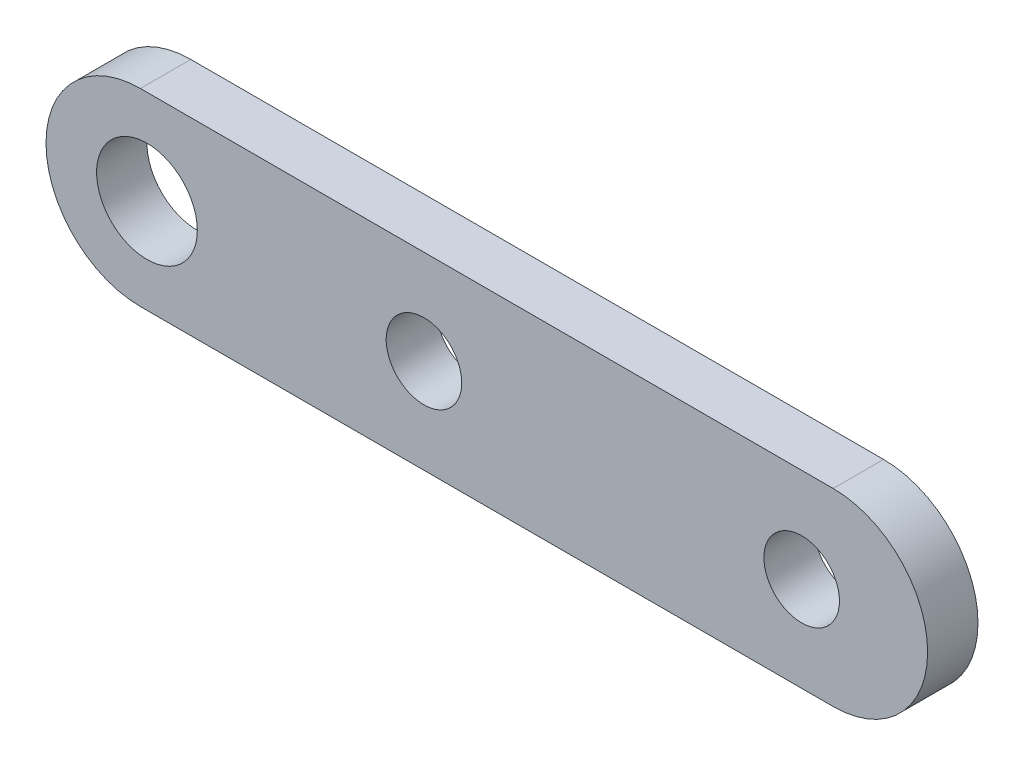
ISO-10303-21;
HEADER;
FILE_DESCRIPTION(('STEP AP214'),'2;1');
FILE_NAME('part.step','',(''),(''),'','','');
FILE_SCHEMA(('AUTOMOTIVE_DESIGN { 1 0 10303 214 1 1 1 1 }'));
ENDSEC;
DATA;
#1=APPLICATION_CONTEXT('core data for automotive mechanical design processes');
#2=APPLICATION_PROTOCOL_DEFINITION('international standard','automotive_design',2000,#1);
#3=PRODUCT_CONTEXT('',#1,'mechanical');
#4=PRODUCT('Part','Part','',(#3));
#5=PRODUCT_RELATED_PRODUCT_CATEGORY('part','',(#4));
#6=PRODUCT_DEFINITION_FORMATION('','',#4);
#7=PRODUCT_DEFINITION_CONTEXT('part definition',#1,'design');
#8=PRODUCT_DEFINITION('design','',#6,#7);
#9=PRODUCT_DEFINITION_SHAPE('','',#8);
#10=(LENGTH_UNIT() NAMED_UNIT(*) SI_UNIT(.MILLI.,.METRE.));
#11=(NAMED_UNIT(*) PLANE_ANGLE_UNIT() SI_UNIT($,.RADIAN.));
#12=(NAMED_UNIT(*) SI_UNIT($,.STERADIAN.) SOLID_ANGLE_UNIT());
#13=UNCERTAINTY_MEASURE_WITH_UNIT(LENGTH_MEASURE(1.E-05),#10,'distance_accuracy_value','');
#14=(GEOMETRIC_REPRESENTATION_CONTEXT(3) GLOBAL_UNCERTAINTY_ASSIGNED_CONTEXT((#13)) GLOBAL_UNIT_ASSIGNED_CONTEXT((#10,
#11,#12)) REPRESENTATION_CONTEXT('',''));
#15=CARTESIAN_POINT('',(0.,0.,0.));
#16=DIRECTION('',(0.,0.,1.));
#17=DIRECTION('',(1.,0.,0.));
#18=AXIS2_PLACEMENT_3D('',#15,#16,#17);
#19=CARTESIAN_POINT('',(62.5026875852541,7.5,4.));
#20=DIRECTION('',(0.,0.,-1.));
#21=DIRECTION('',(-1.,0.,0.));
#22=AXIS2_PLACEMENT_3D('',#19,#20,#21);
#23=CYLINDRICAL_SURFACE('',#22,7.5);
#24=CARTESIAN_POINT('',(62.5026875852541,7.5,0.));
#25=DIRECTION('',(0.,0.,1.));
#26=DIRECTION('',(1.,0.,0.));
#27=AXIS2_PLACEMENT_3D('',#24,#25,#26);
#28=CIRCLE('',#27,7.5);
#29=CARTESIAN_POINT('',(62.5026875852541,0.,0.));
#30=VERTEX_POINT('',#29);
#31=CARTESIAN_POINT('',(62.5026875852541,15.,0.));
#32=VERTEX_POINT('',#31);
#33=EDGE_CURVE('E98',#30,#32,#28,.T.);
#34=ORIENTED_EDGE('',*,*,#33,.T.);
#35=DIRECTION('',(0.,0.,-1.));
#36=VECTOR('',#35,1.);
#37=CARTESIAN_POINT('',(62.5026875852541,15.,4.));
#38=LINE('',#37,#36);
#39=CARTESIAN_POINT('',(62.5026875852541,15.,4.));
#40=VERTEX_POINT('',#39);
#41=EDGE_CURVE('E11',#40,#32,#38,.T.);
#42=ORIENTED_EDGE('',*,*,#41,.F.);
#43=CARTESIAN_POINT('',(62.5026875852541,7.5,4.));
#44=DIRECTION('',(0.,0.,1.));
#45=DIRECTION('',(1.,0.,0.));
#46=AXIS2_PLACEMENT_3D('',#43,#44,#45);
#47=CIRCLE('',#46,7.5);
#48=CARTESIAN_POINT('',(62.5026875852541,0.,4.));
#49=VERTEX_POINT('',#48);
#50=EDGE_CURVE('E86',#49,#40,#47,.T.);
#51=ORIENTED_EDGE('',*,*,#50,.F.);
#52=DIRECTION('',(0.,0.,-1.));
#53=VECTOR('',#52,1.);
#54=CARTESIAN_POINT('',(62.5026875852541,0.,4.));
#55=LINE('',#54,#53);
#56=EDGE_CURVE('E94',#49,#30,#55,.T.);
#57=ORIENTED_EDGE('',*,*,#56,.T.);
#58=EDGE_LOOP('',(#34,#42,#51,#57));
#59=FACE_BOUND('',#58,.T.);
#60=ADVANCED_FACE('F35',(#59),#23,.T.);
#61=CARTESIAN_POINT('',(7.48312890453905,15.,4.));
#62=DIRECTION('',(0.,-1.,0.));
#63=DIRECTION('',(0.,0.,-1.));
#64=AXIS2_PLACEMENT_3D('',#61,#62,#63);
#65=PLANE('',#64);
#66=DIRECTION('',(-1.,0.,0.));
#67=VECTOR('',#66,1.);
#68=CARTESIAN_POINT('',(7.48312890453905,15.,0.));
#69=LINE('',#68,#67);
#70=CARTESIAN_POINT('',(7.48312890453905,15.,0.));
#71=VERTEX_POINT('',#70);
#72=EDGE_CURVE('E90',#32,#71,#69,.T.);
#73=ORIENTED_EDGE('',*,*,#72,.T.);
#74=DIRECTION('',(0.,0.,-1.));
#75=VECTOR('',#74,1.);
#76=CARTESIAN_POINT('',(7.48312890453905,15.,4.));
#77=LINE('',#76,#75);
#78=CARTESIAN_POINT('',(7.48312890453905,15.,4.));
#79=VERTEX_POINT('',#78);
#80=EDGE_CURVE('E43',#79,#71,#77,.T.);
#81=ORIENTED_EDGE('',*,*,#80,.F.);
#82=DIRECTION('',(-1.,0.,0.));
#83=VECTOR('',#82,1.);
#84=CARTESIAN_POINT('',(7.48312890453905,15.,4.));
#85=LINE('',#84,#83);
#86=EDGE_CURVE('E81',#40,#79,#85,.T.);
#87=ORIENTED_EDGE('',*,*,#86,.F.);
#88=ORIENTED_EDGE('',*,*,#41,.T.);
#89=EDGE_LOOP('',(#73,#81,#87,#88));
#90=FACE_BOUND('',#89,.T.);
#91=ADVANCED_FACE('F89',(#90),#65,.F.);
#92=CARTESIAN_POINT('',(7.48312890453905,7.5,4.));
#93=DIRECTION('',(0.,0.,-1.));
#94=DIRECTION('',(-1.,0.,0.));
#95=AXIS2_PLACEMENT_3D('',#92,#93,#94);
#96=CYLINDRICAL_SURFACE('',#95,7.5);
#97=CARTESIAN_POINT('',(7.48312890453905,7.5,0.));
#98=DIRECTION('',(0.,0.,1.));
#99=DIRECTION('',(1.,0.,0.));
#100=AXIS2_PLACEMENT_3D('',#97,#98,#99);
#101=CIRCLE('',#100,7.5);
#102=CARTESIAN_POINT('',(7.48312890453905,0.,0.));
#103=VERTEX_POINT('',#102);
#104=EDGE_CURVE('E68',#71,#103,#101,.T.);
#105=ORIENTED_EDGE('',*,*,#104,.T.);
#106=DIRECTION('',(0.,0.,-1.));
#107=VECTOR('',#106,1.);
#108=CARTESIAN_POINT('',(7.48312890453905,0.,4.));
#109=LINE('',#108,#107);
#110=CARTESIAN_POINT('',(7.48312890453905,0.,4.));
#111=VERTEX_POINT('',#110);
#112=EDGE_CURVE('E91',#111,#103,#109,.T.);
#113=ORIENTED_EDGE('',*,*,#112,.F.);
#114=CARTESIAN_POINT('',(7.48312890453905,7.5,4.));
#115=DIRECTION('',(0.,0.,1.));
#116=DIRECTION('',(1.,0.,0.));
#117=AXIS2_PLACEMENT_3D('',#114,#115,#116);
#118=CIRCLE('',#117,7.5);
#119=EDGE_CURVE('E84',#79,#111,#118,.T.);
#120=ORIENTED_EDGE('',*,*,#119,.F.);
#121=ORIENTED_EDGE('',*,*,#80,.T.);
#122=EDGE_LOOP('',(#105,#113,#120,#121));
#123=FACE_BOUND('',#122,.T.);
#124=ADVANCED_FACE('F92',(#123),#96,.T.);
#125=CARTESIAN_POINT('',(7.48312890453905,0.,4.));
#126=DIRECTION('',(0.,1.,0.));
#127=DIRECTION('',(0.,0.,1.));
#128=AXIS2_PLACEMENT_3D('',#125,#126,#127);
#129=PLANE('',#128);
#130=DIRECTION('',(1.,0.,0.));
#131=VECTOR('',#130,1.);
#132=CARTESIAN_POINT('',(7.48312890453905,0.,0.));
#133=LINE('',#132,#131);
#134=EDGE_CURVE('E74',#103,#30,#133,.T.);
#135=ORIENTED_EDGE('',*,*,#134,.T.);
#136=ORIENTED_EDGE('',*,*,#56,.F.);
#137=DIRECTION('',(1.,0.,0.));
#138=VECTOR('',#137,1.);
#139=CARTESIAN_POINT('',(7.48312890453905,0.,4.));
#140=LINE('',#139,#138);
#141=EDGE_CURVE('E51',#111,#49,#140,.T.);
#142=ORIENTED_EDGE('',*,*,#141,.F.);
#143=ORIENTED_EDGE('',*,*,#112,.T.);
#144=EDGE_LOOP('',(#135,#136,#142,#143));
#145=FACE_BOUND('',#144,.T.);
#146=ADVANCED_FACE('F106',(#145),#129,.F.);
#147=CARTESIAN_POINT('',(62.5026875852541,7.5,4.));
#148=DIRECTION('',(0.,0.,1.));
#149=DIRECTION('',(1.,0.,0.));
#150=AXIS2_PLACEMENT_3D('',#147,#148,#149);
#151=PLANE('',#150);
#152=CARTESIAN_POINT('',(60.,7.5,4.));
#153=DIRECTION('',(0.,0.,1.));
#154=DIRECTION('',(1.,0.,0.));
#155=AXIS2_PLACEMENT_3D('',#152,#153,#154);
#156=CIRCLE('',#155,3.);
#157=CARTESIAN_POINT('',(63.,7.5,4.));
#158=VERTEX_POINT('',#157);
#159=EDGE_CURVE('E124',#158,#158,#156,.T.);
#160=ORIENTED_EDGE('',*,*,#159,.F.);
#161=EDGE_LOOP('',(#160));
#162=FACE_BOUND('',#161,.T.);
#163=CARTESIAN_POINT('',(30.,7.5,4.));
#164=DIRECTION('',(0.,0.,1.));
#165=DIRECTION('',(1.,0.,0.));
#166=AXIS2_PLACEMENT_3D('',#163,#164,#165);
#167=CIRCLE('',#166,3.);
#168=CARTESIAN_POINT('',(33.,7.5,4.));
#169=VERTEX_POINT('',#168);
#170=EDGE_CURVE('E118',#169,#169,#167,.T.);
#171=ORIENTED_EDGE('',*,*,#170,.F.);
#172=EDGE_LOOP('',(#171));
#173=FACE_BOUND('',#172,.T.);
#174=CARTESIAN_POINT('',(8.,7.5,4.));
#175=DIRECTION('',(0.,0.,1.));
#176=DIRECTION('',(1.,0.,0.));
#177=AXIS2_PLACEMENT_3D('',#174,#175,#176);
#178=CIRCLE('',#177,4.);
#179=CARTESIAN_POINT('',(12.,7.5,4.));
#180=VERTEX_POINT('',#179);
#181=EDGE_CURVE('E112',#180,#180,#178,.T.);
#182=ORIENTED_EDGE('',*,*,#181,.F.);
#183=EDGE_LOOP('',(#182));
#184=FACE_BOUND('',#183,.T.);
#185=ORIENTED_EDGE('',*,*,#50,.T.);
#186=ORIENTED_EDGE('',*,*,#86,.T.);
#187=ORIENTED_EDGE('',*,*,#119,.T.);
#188=ORIENTED_EDGE('',*,*,#141,.T.);
#189=EDGE_LOOP('',(#185,#186,#187,#188));
#190=FACE_BOUND('',#189,.T.);
#191=ADVANCED_FACE('F82',(#162,#173,#184,#190),#151,.T.);
#192=CARTESIAN_POINT('',(62.5026875852541,7.5,0.));
#193=DIRECTION('',(0.,0.,1.));
#194=DIRECTION('',(1.,0.,0.));
#195=AXIS2_PLACEMENT_3D('',#192,#193,#194);
#196=PLANE('',#195);
#197=CARTESIAN_POINT('',(60.,7.5,0.));
#198=DIRECTION('',(0.,0.,1.));
#199=DIRECTION('',(1.,0.,0.));
#200=AXIS2_PLACEMENT_3D('',#197,#198,#199);
#201=CIRCLE('',#200,3.);
#202=CARTESIAN_POINT('',(63.,7.5,0.));
#203=VERTEX_POINT('',#202);
#204=EDGE_CURVE('E121',#203,#203,#201,.T.);
#205=ORIENTED_EDGE('',*,*,#204,.T.);
#206=EDGE_LOOP('',(#205));
#207=FACE_BOUND('',#206,.T.);
#208=CARTESIAN_POINT('',(30.,7.5,0.));
#209=DIRECTION('',(0.,0.,1.));
#210=DIRECTION('',(1.,0.,0.));
#211=AXIS2_PLACEMENT_3D('',#208,#209,#210);
#212=CIRCLE('',#211,3.);
#213=CARTESIAN_POINT('',(33.,7.5,0.));
#214=VERTEX_POINT('',#213);
#215=EDGE_CURVE('E115',#214,#214,#212,.T.);
#216=ORIENTED_EDGE('',*,*,#215,.T.);
#217=EDGE_LOOP('',(#216));
#218=FACE_BOUND('',#217,.T.);
#219=CARTESIAN_POINT('',(8.,7.5,0.));
#220=DIRECTION('',(0.,0.,1.));
#221=DIRECTION('',(1.,0.,0.));
#222=AXIS2_PLACEMENT_3D('',#219,#220,#221);
#223=CIRCLE('',#222,4.);
#224=CARTESIAN_POINT('',(12.,7.5,0.));
#225=VERTEX_POINT('',#224);
#226=EDGE_CURVE('E101',#225,#225,#223,.T.);
#227=ORIENTED_EDGE('',*,*,#226,.T.);
#228=EDGE_LOOP('',(#227));
#229=FACE_BOUND('',#228,.T.);
#230=ORIENTED_EDGE('',*,*,#33,.F.);
#231=ORIENTED_EDGE('',*,*,#134,.F.);
#232=ORIENTED_EDGE('',*,*,#104,.F.);
#233=ORIENTED_EDGE('',*,*,#72,.F.);
#234=EDGE_LOOP('',(#230,#231,#232,#233));
#235=FACE_BOUND('',#234,.T.);
#236=ADVANCED_FACE('F109',(#207,#218,#229,#235),#196,.F.);
#237=CARTESIAN_POINT('',(8.,7.5,0.));
#238=DIRECTION('',(0.,0.,1.));
#239=DIRECTION('',(1.,0.,0.));
#240=AXIS2_PLACEMENT_3D('',#237,#238,#239);
#241=CYLINDRICAL_SURFACE('',#240,4.);
#242=ORIENTED_EDGE('',*,*,#226,.F.);
#243=EDGE_LOOP('',(#242));
#244=FACE_BOUND('',#243,.T.);
#245=ORIENTED_EDGE('',*,*,#181,.T.);
#246=EDGE_LOOP('',(#245));
#247=FACE_BOUND('',#246,.T.);
#248=ADVANCED_FACE('F146',(#244,#247),#241,.F.);
#249=CARTESIAN_POINT('',(30.,7.5,0.));
#250=DIRECTION('',(0.,0.,1.));
#251=DIRECTION('',(1.,0.,0.));
#252=AXIS2_PLACEMENT_3D('',#249,#250,#251);
#253=CYLINDRICAL_SURFACE('',#252,3.);
#254=ORIENTED_EDGE('',*,*,#215,.F.);
#255=EDGE_LOOP('',(#254));
#256=FACE_BOUND('',#255,.T.);
#257=ORIENTED_EDGE('',*,*,#170,.T.);
#258=EDGE_LOOP('',(#257));
#259=FACE_BOUND('',#258,.T.);
#260=ADVANCED_FACE('F135',(#256,#259),#253,.F.);
#261=CARTESIAN_POINT('',(60.,7.5,0.));
#262=DIRECTION('',(0.,0.,1.));
#263=DIRECTION('',(1.,0.,0.));
#264=AXIS2_PLACEMENT_3D('',#261,#262,#263);
#265=CYLINDRICAL_SURFACE('',#264,3.);
#266=ORIENTED_EDGE('',*,*,#204,.F.);
#267=EDGE_LOOP('',(#266));
#268=FACE_BOUND('',#267,.T.);
#269=ORIENTED_EDGE('',*,*,#159,.T.);
#270=EDGE_LOOP('',(#269));
#271=FACE_BOUND('',#270,.T.);
#272=ADVANCED_FACE('F132',(#268,#271),#265,.F.);
#273=CLOSED_SHELL('',(#60,#91,#124,#146,#191,#236,#248,#260,#272));
#274=MANIFOLD_SOLID_BREP('B2',#273);
#275=ADVANCED_BREP_SHAPE_REPRESENTATION('',(#18,#274),#14);
#276=SHAPE_DEFINITION_REPRESENTATION(#9,#275);
ENDSEC;
END-ISO-10303-21;
